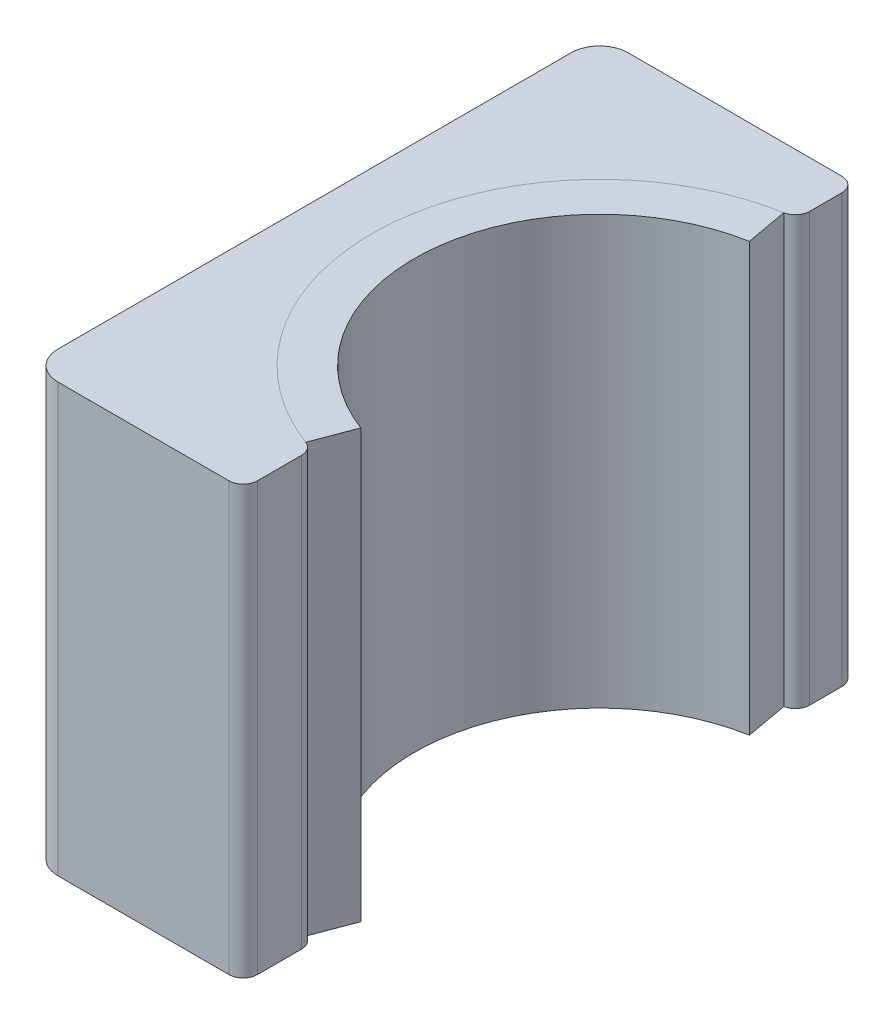
ISO-10303-21;
HEADER;
FILE_DESCRIPTION(('STEP AP214'),'2;1');
FILE_NAME('part.step','',(''),(''),'','','');
FILE_SCHEMA(('AUTOMOTIVE_DESIGN { 1 0 10303 214 1 1 1 1 }'));
ENDSEC;
DATA;
#1=APPLICATION_CONTEXT('core data for automotive mechanical design processes');
#2=APPLICATION_PROTOCOL_DEFINITION('international standard','automotive_design',2000,#1);
#3=PRODUCT_CONTEXT('',#1,'mechanical');
#4=PRODUCT('Part','Part','',(#3));
#5=PRODUCT_RELATED_PRODUCT_CATEGORY('part','',(#4));
#6=PRODUCT_DEFINITION_FORMATION('','',#4);
#7=PRODUCT_DEFINITION_CONTEXT('part definition',#1,'design');
#8=PRODUCT_DEFINITION('design','',#6,#7);
#9=PRODUCT_DEFINITION_SHAPE('','',#8);
#10=(LENGTH_UNIT() NAMED_UNIT(*) SI_UNIT(.MILLI.,.METRE.));
#11=(NAMED_UNIT(*) PLANE_ANGLE_UNIT() SI_UNIT($,.RADIAN.));
#12=(NAMED_UNIT(*) SI_UNIT($,.STERADIAN.) SOLID_ANGLE_UNIT());
#13=UNCERTAINTY_MEASURE_WITH_UNIT(LENGTH_MEASURE(1.E-05),#10,'distance_accuracy_value','');
#14=(GEOMETRIC_REPRESENTATION_CONTEXT(3) GLOBAL_UNCERTAINTY_ASSIGNED_CONTEXT((#13)) GLOBAL_UNIT_ASSIGNED_CONTEXT((#10,
#11,#12)) REPRESENTATION_CONTEXT('',''));
#15=CARTESIAN_POINT('',(0.,0.,0.));
#16=DIRECTION('',(0.,0.,1.));
#17=DIRECTION('',(1.,0.,0.));
#18=AXIS2_PLACEMENT_3D('',#15,#16,#17);
#19=CARTESIAN_POINT('',(17.,-15.,-19.));
#20=DIRECTION('',(0.,-1.,0.));
#21=DIRECTION('',(0.,0.,-1.));
#22=AXIS2_PLACEMENT_3D('',#19,#20,#21);
#23=PLANE('',#22);
#24=CARTESIAN_POINT('',(20.,-15.,0.));
#25=DIRECTION('',(0.,-1.,0.));
#26=DIRECTION('',(0.,0.,-1.));
#27=AXIS2_PLACEMENT_3D('',#24,#25,#26);
#28=CIRCLE('',#27,16.);
#29=CARTESIAN_POINT('',(17.1764705882353,-15.,-15.748894617112));
#30=VERTEX_POINT('',#29);
#31=CARTESIAN_POINT('',(14.3529411764706,-15.,14.9703282076112));
#32=VERTEX_POINT('',#31);
#33=EDGE_CURVE('E53',#30,#32,#28,.F.);
#34=ORIENTED_EDGE('',*,*,#33,.F.);
#35=DIRECTION('',(-0.176470588235294,0.,-0.984305913569501));
#36=VECTOR('',#35,1.);
#37=CARTESIAN_POINT('',(17.1764705882353,-15.,-15.748894617112));
#38=LINE('',#37,#36);
#39=CARTESIAN_POINT('',(17.7058823529412,-15.,-12.7959768764035));
#40=VERTEX_POINT('',#39);
#41=EDGE_CURVE('E76',#40,#30,#38,.T.);
#42=ORIENTED_EDGE('',*,*,#41,.F.);
#43=CARTESIAN_POINT('',(20.,-15.,0.));
#44=DIRECTION('',(0.,-1.,0.));
#45=DIRECTION('',(0.,0.,-1.));
#46=AXIS2_PLACEMENT_3D('',#43,#44,#45);
#47=CIRCLE('',#46,13.);
#48=CARTESIAN_POINT('',(15.4117647058824,-15.,12.1633916686841));
#49=VERTEX_POINT('',#48);
#50=EDGE_CURVE('E81',#49,#40,#47,.T.);
#51=ORIENTED_EDGE('',*,*,#50,.F.);
#52=DIRECTION('',(0.352941176470587,0.,-0.935645512975699));
#53=VECTOR('',#52,1.);
#54=CARTESIAN_POINT('',(15.4117647058824,-15.,12.1633916686841));
#55=LINE('',#54,#53);
#56=EDGE_CURVE('E96',#32,#49,#55,.T.);
#57=ORIENTED_EDGE('',*,*,#56,.F.);
#58=EDGE_LOOP('',(#34,#42,#51,#57));
#59=FACE_BOUND('',#58,.T.);
#60=ADVANCED_FACE('F45',(#59),#23,.T.);
#61=CARTESIAN_POINT('',(20.,15.,0.));
#62=DIRECTION('',(0.,1.,0.));
#63=DIRECTION('',(0.,0.,1.));
#64=AXIS2_PLACEMENT_3D('',#61,#62,#63);
#65=PLANE('',#64);
#66=CARTESIAN_POINT('',(20.,15.,0.));
#67=DIRECTION('',(0.,1.,0.));
#68=DIRECTION('',(0.,0.,1.));
#69=AXIS2_PLACEMENT_3D('',#66,#67,#68);
#70=CIRCLE('',#69,16.);
#71=CARTESIAN_POINT('',(17.1764705882353,15.,-15.748894617112));
#72=VERTEX_POINT('',#71);
#73=CARTESIAN_POINT('',(14.3529411764706,15.,14.9703282076112));
#74=VERTEX_POINT('',#73);
#75=EDGE_CURVE('E105',#72,#74,#70,.T.);
#76=ORIENTED_EDGE('',*,*,#75,.T.);
#77=DIRECTION('',(0.352941176470587,0.,-0.935645512975698));
#78=VECTOR('',#77,1.);
#79=CARTESIAN_POINT('',(15.4117647058824,15.,12.1633916686841));
#80=LINE('',#79,#78);
#81=CARTESIAN_POINT('',(15.4117647058824,15.,12.1633916686841));
#82=VERTEX_POINT('',#81);
#83=EDGE_CURVE('E94',#74,#82,#80,.T.);
#84=ORIENTED_EDGE('',*,*,#83,.T.);
#85=CARTESIAN_POINT('',(20.,15.,0.));
#86=DIRECTION('',(0.,-1.,0.));
#87=DIRECTION('',(0.,0.,1.));
#88=AXIS2_PLACEMENT_3D('',#85,#86,#87);
#89=CIRCLE('',#88,13.);
#90=CARTESIAN_POINT('',(17.7058823529412,15.,-12.7959768764035));
#91=VERTEX_POINT('',#90);
#92=EDGE_CURVE('E97',#82,#91,#89,.T.);
#93=ORIENTED_EDGE('',*,*,#92,.T.);
#94=DIRECTION('',(-0.176470588235294,0.,-0.984305913569501));
#95=VECTOR('',#94,1.);
#96=CARTESIAN_POINT('',(17.1764705882353,15.,-15.748894617112));
#97=LINE('',#96,#95);
#98=EDGE_CURVE('E102',#91,#72,#97,.T.);
#99=ORIENTED_EDGE('',*,*,#98,.T.);
#100=EDGE_LOOP('',(#76,#84,#93,#99));
#101=FACE_BOUND('',#100,.T.);
#102=ADVANCED_FACE('F104',(#101),#65,.T.);
#103=CARTESIAN_POINT('',(15.4117647058824,-48.6381013439769,12.1633916686841));
#104=DIRECTION('',(0.935645512975698,0.,0.352941176470587));
#105=DIRECTION('',(0.352941176470587,0.,-0.935645512975699));
#106=AXIS2_PLACEMENT_3D('',#103,#104,#105);
#107=PLANE('',#106);
#108=DIRECTION('',(0.,1.,0.));
#109=VECTOR('',#108,1.);
#110=CARTESIAN_POINT('',(14.3529411764706,-48.6381013439769,14.9703282076112));
#111=LINE('',#110,#109);
#112=EDGE_CURVE('E12',#32,#74,#111,.T.);
#113=ORIENTED_EDGE('',*,*,#112,.F.);
#114=ORIENTED_EDGE('',*,*,#56,.T.);
#115=DIRECTION('',(0.,1.,0.));
#116=VECTOR('',#115,1.);
#117=CARTESIAN_POINT('',(15.4117647058824,-48.6381013439769,12.1633916686841));
#118=LINE('',#117,#116);
#119=EDGE_CURVE('E91',#49,#82,#118,.T.);
#120=ORIENTED_EDGE('',*,*,#119,.T.);
#121=ORIENTED_EDGE('',*,*,#83,.F.);
#122=EDGE_LOOP('',(#113,#114,#120,#121));
#123=FACE_BOUND('',#122,.T.);
#124=ADVANCED_FACE('F92',(#123),#107,.T.);
#125=CARTESIAN_POINT('',(20.,-48.6381013439769,0.));
#126=DIRECTION('',(0.,1.,0.));
#127=DIRECTION('',(0.,0.,1.));
#128=AXIS2_PLACEMENT_3D('',#125,#126,#127);
#129=CYLINDRICAL_SURFACE('',#128,13.);
#130=ORIENTED_EDGE('',*,*,#119,.F.);
#131=ORIENTED_EDGE('',*,*,#50,.T.);
#132=DIRECTION('',(0.,1.,0.));
#133=VECTOR('',#132,1.);
#134=CARTESIAN_POINT('',(17.7058823529412,-48.6381013439769,-12.7959768764035));
#135=LINE('',#134,#133);
#136=EDGE_CURVE('E86',#40,#91,#135,.T.);
#137=ORIENTED_EDGE('',*,*,#136,.T.);
#138=ORIENTED_EDGE('',*,*,#92,.F.);
#139=EDGE_LOOP('',(#130,#131,#137,#138));
#140=FACE_BOUND('',#139,.T.);
#141=ADVANCED_FACE('F98',(#140),#129,.F.);
#142=CARTESIAN_POINT('',(17.1764705882353,-48.6381013439769,-15.748894617112));
#143=DIRECTION('',(0.984305913569501,0.,-0.176470588235294));
#144=DIRECTION('',(-0.176470588235294,0.,-0.984305913569501));
#145=AXIS2_PLACEMENT_3D('',#142,#143,#144);
#146=PLANE('',#145);
#147=ORIENTED_EDGE('',*,*,#136,.F.);
#148=ORIENTED_EDGE('',*,*,#41,.T.);
#149=DIRECTION('',(0.,1.,0.));
#150=VECTOR('',#149,1.);
#151=CARTESIAN_POINT('',(17.1764705882353,-48.6381013439769,-15.748894617112));
#152=LINE('',#151,#150);
#153=EDGE_CURVE('E112',#30,#72,#152,.T.);
#154=ORIENTED_EDGE('',*,*,#153,.T.);
#155=ORIENTED_EDGE('',*,*,#98,.F.);
#156=EDGE_LOOP('',(#147,#148,#154,#155));
#157=FACE_BOUND('',#156,.T.);
#158=ADVANCED_FACE('F118',(#157),#146,.T.);
#159=CARTESIAN_POINT('',(20.,-48.6381013439769,0.));
#160=DIRECTION('',(0.,1.,0.));
#161=DIRECTION('',(0.,0.,1.));
#162=AXIS2_PLACEMENT_3D('',#159,#160,#161);
#163=CYLINDRICAL_SURFACE('',#162,16.);
#164=ORIENTED_EDGE('',*,*,#153,.F.);
#165=ORIENTED_EDGE('',*,*,#33,.T.);
#166=ORIENTED_EDGE('',*,*,#112,.T.);
#167=ORIENTED_EDGE('',*,*,#75,.F.);
#168=EDGE_LOOP('',(#164,#165,#166,#167));
#169=FACE_BOUND('',#168,.T.);
#170=ADVANCED_FACE('F119',(#169),#163,.T.);
#171=CLOSED_SHELL('',(#60,#102,#124,#141,#158,#170));
#172=MANIFOLD_SOLID_BREP('B2_NOT_SHOWN',#171);
#173=CARTESIAN_POINT('',(20.,-15.,0.));
#174=DIRECTION('',(0.,1.,0.));
#175=DIRECTION('',(0.,0.,1.));
#176=AXIS2_PLACEMENT_3D('',#173,#174,#175);
#177=CYLINDRICAL_SURFACE('',#176,16.);
#178=CARTESIAN_POINT('',(8.38104996137778,-10.5,-11.));
#179=CARTESIAN_POINT('',(8.3810475620275,-10.6386845196879,-10.9999980279482));
#180=CARTESIAN_POINT('',(8.37185108734168,-10.7773815380396,-10.9903078456259));
#181=CARTESIAN_POINT('',(8.33612618465714,-11.0499193482511,-10.9523829005863));
#182=CARTESIAN_POINT('',(8.30958441363945,-11.1837563177435,-10.9241338612192));
#183=CARTESIAN_POINT('',(8.24209452212185,-11.4418457077826,-10.8514543052294));
#184=CARTESIAN_POINT('',(8.20125533540042,-11.5661621732974,-10.8071460580649));
#185=CARTESIAN_POINT('',(8.10824455663277,-11.8043605245881,-10.7047158943856));
#186=CARTESIAN_POINT('',(8.05606523434676,-11.9182352168475,-10.6465845525126));
#187=CARTESIAN_POINT('',(7.91954702173269,-12.1801691399977,-10.4917697319258));
#188=CARTESIAN_POINT('',(7.83090879926609,-12.3224812554831,-10.3891515910331));
#189=CARTESIAN_POINT('',(7.64325392445338,-12.5835976833256,-10.165247114262));
#190=CARTESIAN_POINT('',(7.54422155715111,-12.7023655926649,-10.0439323773569));
#191=CARTESIAN_POINT('',(7.33871414059765,-12.9181981505635,-9.78365169208199));
#192=CARTESIAN_POINT('',(7.23213385201703,-13.0148105504875,-9.64439565429435));
#193=CARTESIAN_POINT('',(7.01708096346853,-13.1829050178105,-9.35289526855976));
#194=CARTESIAN_POINT('',(6.90860848006324,-13.25438862749,-9.20065171843482));
#195=CARTESIAN_POINT('',(6.67369516689655,-13.3815497673433,-8.85776559140331));
#196=CARTESIAN_POINT('',(6.54746563965424,-13.432203477192,-8.66509100053056));
#197=CARTESIAN_POINT('',(6.30078957678406,-13.4945501123024,-8.26957035052267));
#198=CARTESIAN_POINT('',(6.18034531830766,-13.5062278180111,-8.06672034941593));
#199=CARTESIAN_POINT('',(6.00856540490153,-13.4922441104659,-7.76228526981618));
#200=CARTESIAN_POINT('',(5.95337821519235,-13.4826195415233,-7.66194663903574));
#201=CARTESIAN_POINT('',(5.845795347123,-13.452980672654,-7.4613264288262));
#202=CARTESIAN_POINT('',(5.79339821469234,-13.4329718442103,-7.36104484716721));
#203=CARTESIAN_POINT('',(5.69182890480617,-13.382307518014,-7.16161770352905));
#204=CARTESIAN_POINT('',(5.64265482355655,-13.351658373908,-7.06247149999667));
#205=CARTESIAN_POINT('',(5.54787158878631,-13.2795529773614,-6.86642765268352));
#206=CARTESIAN_POINT('',(5.50226179771551,-13.2380986634362,-6.76952960896113));
#207=CARTESIAN_POINT('',(5.42049753289846,-13.150356739905,-6.59139288493639));
#208=CARTESIAN_POINT('',(5.38387863710001,-13.1053570428793,-6.50973152939608));
#209=CARTESIAN_POINT('',(5.31378439874695,-13.0072548374729,-6.3500137418465));
#210=CARTESIAN_POINT('',(5.2803085427089,-12.9541536563784,-6.27195672205377));
#211=CARTESIAN_POINT('',(5.21665515001901,-12.8401147962579,-6.12041386042684));
#212=CARTESIAN_POINT('',(5.18647568088138,-12.7791817547183,-6.0469253513391));
#213=CARTESIAN_POINT('',(5.12950183594237,-12.6498786922659,-5.90543045066559));
#214=CARTESIAN_POINT('',(5.1027070845246,-12.5815094981442,-5.83742345107732));
#215=CARTESIAN_POINT('',(5.03345401111291,-12.3830492357788,-5.65839760871739));
#216=CARTESIAN_POINT('',(4.99457953296718,-12.2455589716542,-5.55399832430719));
#217=CARTESIAN_POINT('',(4.92759939640307,-11.9528776740198,-5.36958532117727));
#218=CARTESIAN_POINT('',(4.8994893180885,-11.7976939395442,-5.28956159654344));
#219=CARTESIAN_POINT('',(4.85526418073865,-11.4847641483737,-5.16151885950927));
#220=CARTESIAN_POINT('',(4.83849952885253,-11.3278098639282,-5.1117869675831));
#221=CARTESIAN_POINT('',(4.81402647049654,-11.0072167508132,-5.03862296637434));
#222=CARTESIAN_POINT('',(4.80631650161494,-10.8435790804253,-5.01518631980226));
#223=CARTESIAN_POINT('',(4.79991268554675,-10.5184173622382,-4.99574251139431));
#224=CARTESIAN_POINT('',(4.80100950615214,-10.3569351226618,-4.99909849350771));
#225=CARTESIAN_POINT('',(4.81173887596207,-10.0368837755444,-5.0316013404478));
#226=CARTESIAN_POINT('',(4.82137092259531,-9.87831449704335,-5.06074668674471));
#227=CARTESIAN_POINT('',(4.84924994831006,-9.56912535539221,-5.14360345462444));
#228=CARTESIAN_POINT('',(4.8674670954321,-9.41847995744886,-5.19722978833555));
#229=CARTESIAN_POINT('',(4.91267687978571,-9.12868428223856,-5.32704224792114));
#230=CARTESIAN_POINT('',(4.93966947934401,-8.98953395562618,-5.40322827694612));
#231=CARTESIAN_POINT('',(5.0029355317803,-8.72470533528119,-5.57643505669231));
#232=CARTESIAN_POINT('',(5.03931859465236,-8.59921289667592,-5.67369953432947));
#233=CARTESIAN_POINT('',(5.12114749911893,-8.36663991918536,-5.88494295925601));
#234=CARTESIAN_POINT('',(5.16659424971289,-8.25956122902689,-5.99892358270806));
#235=CARTESIAN_POINT('',(5.26807411172599,-8.06229547189356,-6.24408197662044));
#236=CARTESIAN_POINT('',(5.32443416692612,-7.97287130916769,-6.37573691966289));
#237=CARTESIAN_POINT('',(5.44589250774826,-7.81715801113458,-6.64832532336101));
#238=CARTESIAN_POINT('',(5.51099319094543,-7.75087524159141,-6.78926132440927));
#239=CARTESIAN_POINT('',(5.65410696550318,-7.63756818500975,-7.08693000675256));
#240=CARTESIAN_POINT('',(5.73272066364865,-7.5923461550138,-7.24405737956683));
#241=CARTESIAN_POINT('',(5.89742194745821,-7.52811301848813,-7.5596986228227));
#242=CARTESIAN_POINT('',(5.9835124683085,-7.50911225556616,-7.71821301560877));
#243=CARTESIAN_POINT('',(6.17162892881427,-7.49530585894294,-8.05087896900503));
#244=CARTESIAN_POINT('',(6.27435357960196,-7.50349836798677,-8.22475816196607));
#245=CARTESIAN_POINT('',(6.48454198768442,-7.54880907444915,-8.56578171646486));
#246=CARTESIAN_POINT('',(6.59200898801574,-7.58594736482288,-8.73292131486089));
#247=CARTESIAN_POINT('',(6.82233969086164,-7.69360111577277,-9.07729222895156));
#248=CARTESIAN_POINT('',(6.945473287282,-7.76765577367554,-9.25324170497194));
#249=CARTESIAN_POINT('',(7.19009089108069,-7.94826168749561,-9.58902354164263));
#250=CARTESIAN_POINT('',(7.31157445049567,-8.05482159097734,-9.74885159834096));
#251=CARTESIAN_POINT('',(7.53136945832989,-8.28296792760897,-10.0279828171026));
#252=CARTESIAN_POINT('',(7.63058810738281,-8.40055213085571,-10.1498419978061));
#253=CARTESIAN_POINT('',(7.81888553259108,-8.65923844733104,-10.3750613075972));
#254=CARTESIAN_POINT('',(7.90797961818671,-8.80030423566979,-10.4784495060113));
#255=CARTESIAN_POINT('',(8.04994223768419,-9.06829620577229,-10.6397728234362));
#256=CARTESIAN_POINT('',(8.10635632163245,-9.1903568022142,-10.7026505378468));
#257=CARTESIAN_POINT('',(8.20602449888157,-9.44651017774951,-10.8123836844924));
#258=CARTESIAN_POINT('',(8.24929442378798,-9.58058822807855,-10.8592584001905));
#259=CARTESIAN_POINT('',(8.31535120025386,-9.84416415123072,-10.9302846179059));
#260=CARTESIAN_POINT('',(8.33976688291688,-9.9727541342672,-10.9562546178131));
#261=CARTESIAN_POINT('',(8.37261246848133,-10.234227391227,-10.9911079686025));
#262=CARTESIAN_POINT('',(8.38105226051369,-10.3671079574149,-11.0000018896846));
#263=CARTESIAN_POINT('',(8.38104996137778,-10.5,-11.));
#264=B_SPLINE_CURVE_WITH_KNOTS('',3,(#178,#179,#180,#181,#182,#183,#184,#185,#186,#187,#188,
#189,#190,#191,#192,#193,#194,#195,#196,#197,#198,#199,#200,#201,#202,#203,#204,#205,#206,#207,
#208,#209,#210,#211,#212,#213,#214,#215,#216,#217,#218,#219,#220,#221,#222,#223,#224,#225,#226,
#227,#228,#229,#230,#231,#232,#233,#234,#235,#236,#237,#238,#239,#240,#241,#242,#243,#244,#245,
#246,#247,#248,#249,#250,#251,#252,#253,#254,#255,#256,#257,#258,#259,#260,#261,#262,#263),
.UNSPECIFIED.,.T.,.F.,(4,2,2,2,2,2,2,2,2,2,2,2,2,2,2,2,2,2,2,2,2,2,2,2,2,2,2,2,2,2,2,2,2,2,2,2,
2,2,2,2,2,2,4),(0.,0.415470707433495,0.8312613961061,1.24395069861444,1.65692220673055,
2.24345674492876,2.83089120262561,3.42941991599914,4.02791188823337,4.73214225272623,
5.43664757660654,5.78098846913266,6.12514811181006,6.46910259907719,6.81299542116966,
7.11309158478706,7.41313863559321,7.71300883078604,8.01284571883038,8.54069625304213,
9.06832981718426,9.56237995216554,10.0563448248355,10.5386038300059,11.0208344406825,
11.5014015892144,11.9819666746859,12.4684170164543,12.9549161690015,13.4592454319845,
13.9637133174017,14.5057573791358,15.0480152020899,15.6519566538021,16.2563177102871,
16.9349072687561,17.6136775141321,18.2003249912317,18.7860732458368,19.2297895292747,
19.6729692358381,20.0713335256957,20.4694511459561),.UNSPECIFIED.);
#265=CARTESIAN_POINT('',(8.38104996137778,-10.5,-11.));
#266=VERTEX_POINT('',#265);
#267=EDGE_CURVE('E348',#266,#266,#264,.T.);
#268=ORIENTED_EDGE('',*,*,#267,.T.);
#269=EDGE_LOOP('',(#268));
#270=FACE_BOUND('',#269,.T.);
#271=DIRECTION('',(0.,1.,0.));
#272=VECTOR('',#271,1.);
#273=CARTESIAN_POINT('',(17.1764705882353,-15.,-15.748894617112));
#274=LINE('',#273,#272);
#275=CARTESIAN_POINT('',(17.1764705882353,-15.,-15.748894617112));
#276=VERTEX_POINT('',#275);
#277=CARTESIAN_POINT('',(17.1764705882353,15.,-15.748894617112));
#278=VERTEX_POINT('',#277);
#279=EDGE_CURVE('E334',#276,#278,#274,.T.);
#280=ORIENTED_EDGE('',*,*,#279,.T.);
#281=CARTESIAN_POINT('',(20.,15.,0.));
#282=DIRECTION('',(0.,-1.,0.));
#283=DIRECTION('',(0.,0.,1.));
#284=AXIS2_PLACEMENT_3D('',#281,#282,#283);
#285=CIRCLE('',#284,16.);
#286=CARTESIAN_POINT('',(14.3529411764706,15.,14.9703282076112));
#287=VERTEX_POINT('',#286);
#288=EDGE_CURVE('E290',#287,#278,#285,.T.);
#289=ORIENTED_EDGE('',*,*,#288,.F.);
#290=DIRECTION('',(0.,1.,0.));
#291=VECTOR('',#290,1.);
#292=CARTESIAN_POINT('',(14.3529411764706,-15.,14.9703282076112));
#293=LINE('',#292,#291);
#294=CARTESIAN_POINT('',(14.3529411764706,-15.,14.9703282076112));
#295=VERTEX_POINT('',#294);
#296=EDGE_CURVE('E336',#295,#287,#293,.T.);
#297=ORIENTED_EDGE('',*,*,#296,.F.);
#298=CARTESIAN_POINT('',(20.,-15.,0.));
#299=DIRECTION('',(0.,-1.,0.));
#300=DIRECTION('',(0.,0.,1.));
#301=AXIS2_PLACEMENT_3D('',#298,#299,#300);
#302=CIRCLE('',#301,16.);
#303=EDGE_CURVE('E316',#295,#276,#302,.T.);
#304=ORIENTED_EDGE('',*,*,#303,.T.);
#305=EDGE_LOOP('',(#280,#289,#297,#304));
#306=FACE_BOUND('',#305,.T.);
#307=CARTESIAN_POINT('',(8.38104996137779,10.5,-11.));
#308=CARTESIAN_POINT('',(8.38104756202751,10.3613154803121,-10.9999980279482));
#309=CARTESIAN_POINT('',(8.37185108734168,10.2226184619604,-10.9903078456259));
#310=CARTESIAN_POINT('',(8.33612618465715,9.95008065174892,-10.9523829005863));
#311=CARTESIAN_POINT('',(8.30958441363946,9.81624368225646,-10.9241338612192));
#312=CARTESIAN_POINT('',(8.24209452212185,9.55815429221737,-10.8514543052294));
#313=CARTESIAN_POINT('',(8.20125533540042,9.43383782670256,-10.807146058065));
#314=CARTESIAN_POINT('',(8.10824455663277,9.19563947541191,-10.7047158943856));
#315=CARTESIAN_POINT('',(8.05606523434676,9.0817647831525,-10.6465845525126));
#316=CARTESIAN_POINT('',(7.91954702173269,8.81983086000231,-10.4917697319258));
#317=CARTESIAN_POINT('',(7.83090879926609,8.6775187445169,-10.3891515910331));
#318=CARTESIAN_POINT('',(7.64325392445338,8.41640231667437,-10.165247114262));
#319=CARTESIAN_POINT('',(7.54422155715112,8.2976344073351,-10.0439323773569));
#320=CARTESIAN_POINT('',(7.33871414059765,8.08180184943648,-9.78365169208199));
#321=CARTESIAN_POINT('',(7.23213385201703,7.98518944951246,-9.64439565429435));
#322=CARTESIAN_POINT('',(7.01708096346854,7.81709498218948,-9.35289526855976));
#323=CARTESIAN_POINT('',(6.90860848006324,7.74561137251004,-9.20065171843483));
#324=CARTESIAN_POINT('',(6.67369516689656,7.6184502326567,-8.85776559140331));
#325=CARTESIAN_POINT('',(6.54746563965424,7.56779652280801,-8.66509100053057));
#326=CARTESIAN_POINT('',(6.30078957678406,7.50544988769759,-8.26957035052268));
#327=CARTESIAN_POINT('',(6.18034531830766,7.49377218198891,-8.06672034941593));
#328=CARTESIAN_POINT('',(6.00856540490153,7.50775588953414,-7.76228526981618));
#329=CARTESIAN_POINT('',(5.95337821519235,7.51738045847669,-7.66194663903575));
#330=CARTESIAN_POINT('',(5.845795347123,7.54701932734603,-7.4613264288262));
#331=CARTESIAN_POINT('',(5.79339821469235,7.56702815578966,-7.36104484716721));
#332=CARTESIAN_POINT('',(5.69182890480617,7.61769248198598,-7.16161770352905));
#333=CARTESIAN_POINT('',(5.64265482355655,7.64834162609198,-7.06247149999667));
#334=CARTESIAN_POINT('',(5.54787158878631,7.72044702263857,-6.86642765268353));
#335=CARTESIAN_POINT('',(5.50226179771551,7.76190133656378,-6.76952960896113));
#336=CARTESIAN_POINT('',(5.42049753289846,7.849643260095,-6.59139288493639));
#337=CARTESIAN_POINT('',(5.38387863710002,7.89464295712066,-6.50973152939608));
#338=CARTESIAN_POINT('',(5.31378439874695,7.99274516252714,-6.35001374184651));
#339=CARTESIAN_POINT('',(5.2803085427089,8.04584634362164,-6.27195672205378));
#340=CARTESIAN_POINT('',(5.21665515001901,8.15988520374208,-6.12041386042684));
#341=CARTESIAN_POINT('',(5.18647568088138,8.22081824528172,-6.0469253513391));
#342=CARTESIAN_POINT('',(5.12950183594237,8.35012130773412,-5.9054304506656));
#343=CARTESIAN_POINT('',(5.10270708452461,8.41849050185583,-5.83742345107732));
#344=CARTESIAN_POINT('',(5.03345401111292,8.61695076422121,-5.65839760871739));
#345=CARTESIAN_POINT('',(4.99457953296718,8.75444102834575,-5.55399832430719));
#346=CARTESIAN_POINT('',(4.92759939640307,9.04712232598017,-5.36958532117727));
#347=CARTESIAN_POINT('',(4.8994893180885,9.20230606045576,-5.28956159654344));
#348=CARTESIAN_POINT('',(4.85526418073866,9.51523585162634,-5.16151885950927));
#349=CARTESIAN_POINT('',(4.83849952885253,9.67219013607182,-5.1117869675831));
#350=CARTESIAN_POINT('',(4.81402647049655,9.99278324918681,-5.03862296637434));
#351=CARTESIAN_POINT('',(4.80631650161494,10.1564209195747,-5.01518631980227));
#352=CARTESIAN_POINT('',(4.79991268554675,10.4815826377618,-4.99574251139432));
#353=CARTESIAN_POINT('',(4.80100950615215,10.6430648773382,-4.99909849350771));
#354=CARTESIAN_POINT('',(4.81173887596207,10.9631162244556,-5.03160134044781));
#355=CARTESIAN_POINT('',(4.82137092259531,11.1216855029567,-5.06074668674471));
#356=CARTESIAN_POINT('',(4.84924994831006,11.4308746446078,-5.14360345462444));
#357=CARTESIAN_POINT('',(4.86746709543211,11.5815200425511,-5.19722978833556));
#358=CARTESIAN_POINT('',(4.91267687978571,11.8713157177614,-5.32704224792115));
#359=CARTESIAN_POINT('',(4.93966947934401,12.0104660443738,-5.40322827694612));
#360=CARTESIAN_POINT('',(5.0029355317803,12.2752946647188,-5.57643505669231));
#361=CARTESIAN_POINT('',(5.03931859465236,12.4007871033241,-5.67369953432947));
#362=CARTESIAN_POINT('',(5.12114749911894,12.6333600808146,-5.88494295925601));
#363=CARTESIAN_POINT('',(5.1665942497129,12.7404387709731,-5.99892358270806));
#364=CARTESIAN_POINT('',(5.26807411172599,12.9377045281064,-6.24408197662044));
#365=CARTESIAN_POINT('',(5.32443416692612,13.0271286908323,-6.3757369196629));
#366=CARTESIAN_POINT('',(5.44589250774826,13.1828419888654,-6.64832532336102));
#367=CARTESIAN_POINT('',(5.51099319094544,13.2491247584086,-6.78926132440928));
#368=CARTESIAN_POINT('',(5.65410696550319,13.3624318149902,-7.08693000675256));
#369=CARTESIAN_POINT('',(5.73272066364865,13.4076538449862,-7.24405737956684));
#370=CARTESIAN_POINT('',(5.89742194745821,13.4718869815119,-7.55969862282271));
#371=CARTESIAN_POINT('',(5.9835124683085,13.4908877444338,-7.71821301560877));
#372=CARTESIAN_POINT('',(6.17162892881427,13.5046941410571,-8.05087896900503));
#373=CARTESIAN_POINT('',(6.27435357960196,13.4965016320132,-8.22475816196607));
#374=CARTESIAN_POINT('',(6.48454198768442,13.4511909255509,-8.56578171646486));
#375=CARTESIAN_POINT('',(6.59200898801574,13.4140526351771,-8.73292131486089));
#376=CARTESIAN_POINT('',(6.82233969086164,13.3063988842272,-9.07729222895156));
#377=CARTESIAN_POINT('',(6.945473287282,13.2323442263245,-9.25324170497194));
#378=CARTESIAN_POINT('',(7.19009089108069,13.0517383125044,-9.58902354164263));
#379=CARTESIAN_POINT('',(7.31157445049567,12.9451784090227,-9.74885159834097));
#380=CARTESIAN_POINT('',(7.53136945832989,12.717032072391,-10.0279828171026));
#381=CARTESIAN_POINT('',(7.63058810738282,12.5994478691443,-10.1498419978061));
#382=CARTESIAN_POINT('',(7.81888553259108,12.340761552669,-10.3750613075972));
#383=CARTESIAN_POINT('',(7.90797961818672,12.1996957643302,-10.4784495060113));
#384=CARTESIAN_POINT('',(8.04994223768419,11.9317037942277,-10.6397728234362));
#385=CARTESIAN_POINT('',(8.10635632163245,11.8096431977858,-10.7026505378468));
#386=CARTESIAN_POINT('',(8.20602449888157,11.5534898222505,-10.8123836844924));
#387=CARTESIAN_POINT('',(8.24929442378798,11.4194117719214,-10.8592584001905));
#388=CARTESIAN_POINT('',(8.31535120025386,11.1558358487693,-10.9302846179059));
#389=CARTESIAN_POINT('',(8.33976688291688,11.0272458657328,-10.9562546178131));
#390=CARTESIAN_POINT('',(8.37261246848133,10.765772608773,-10.9911079686025));
#391=CARTESIAN_POINT('',(8.3810522605137,10.6328920425851,-11.0000018896846));
#392=CARTESIAN_POINT('',(8.38104996137779,10.5,-11.));
#393=B_SPLINE_CURVE_WITH_KNOTS('',3,(#307,#308,#309,#310,#311,#312,#313,#314,#315,#316,#317,
#318,#319,#320,#321,#322,#323,#324,#325,#326,#327,#328,#329,#330,#331,#332,#333,#334,#335,#336,
#337,#338,#339,#340,#341,#342,#343,#344,#345,#346,#347,#348,#349,#350,#351,#352,#353,#354,#355,
#356,#357,#358,#359,#360,#361,#362,#363,#364,#365,#366,#367,#368,#369,#370,#371,#372,#373,#374,
#375,#376,#377,#378,#379,#380,#381,#382,#383,#384,#385,#386,#387,#388,#389,#390,#391,#392),
.UNSPECIFIED.,.T.,.F.,(4,2,2,2,2,2,2,2,2,2,2,2,2,2,2,2,2,2,2,2,2,2,2,2,2,2,2,2,2,2,2,2,2,2,2,2,
2,2,2,2,2,2,4),(0.,0.415470707433495,0.8312613961061,1.24395069861444,1.65692220673055,
2.24345674492876,2.83089120262561,3.42941991599914,4.02791188823336,4.73214225272623,
5.43664757660653,5.78098846913266,6.12514811181006,6.46910259907719,6.81299542116966,
7.11309158478706,7.41313863559321,7.71300883078604,8.01284571883038,8.54069625304213,
9.06832981718426,9.56237995216554,10.0563448248355,10.5386038300059,11.0208344406825,
11.5014015892144,11.9819666746859,12.4684170164543,12.9549161690015,13.4592454319845,
13.9637133174017,14.5057573791358,15.0480152020899,15.6519566538021,16.2563177102871,
16.9349072687561,17.6136775141321,18.2003249912317,18.7860732458368,19.2297895292747,
19.6729692358381,20.0713335256957,20.4694511459561),.UNSPECIFIED.);
#394=CARTESIAN_POINT('',(8.38104996137779,10.5,-11.));
#395=VERTEX_POINT('',#394);
#396=EDGE_CURVE('E356',#395,#395,#393,.T.);
#397=ORIENTED_EDGE('',*,*,#396,.T.);
#398=EDGE_LOOP('',(#397));
#399=FACE_BOUND('',#398,.T.);
#400=ADVANCED_FACE('F169',(#270,#306,#399),#177,.F.);
#401=CARTESIAN_POINT('',(0.,-15.,-20.));
#402=DIRECTION('',(0.,0.,-1.));
#403=DIRECTION('',(-1.,0.,0.));
#404=AXIS2_PLACEMENT_3D('',#401,#402,#403);
#405=PLANE('',#404);
#406=DIRECTION('',(-1.,0.,0.));
#407=VECTOR('',#406,1.);
#408=CARTESIAN_POINT('',(0.,-15.,-20.));
#409=LINE('',#408,#407);
#410=CARTESIAN_POINT('',(17.,-15.,-20.));
#411=VERTEX_POINT('',#410);
#412=CARTESIAN_POINT('',(2.,-15.,-20.));
#413=VERTEX_POINT('',#412);
#414=EDGE_CURVE('E302',#411,#413,#409,.T.);
#415=ORIENTED_EDGE('',*,*,#414,.T.);
#416=DIRECTION('',(0.,1.,0.));
#417=VECTOR('',#416,1.);
#418=CARTESIAN_POINT('',(2.,-15.,-20.));
#419=LINE('',#418,#417);
#420=CARTESIAN_POINT('',(2.,15.,-20.));
#421=VERTEX_POINT('',#420);
#422=EDGE_CURVE('E43',#413,#421,#419,.T.);
#423=ORIENTED_EDGE('',*,*,#422,.T.);
#424=DIRECTION('',(-1.,0.,0.));
#425=VECTOR('',#424,1.);
#426=CARTESIAN_POINT('',(0.,15.,-20.));
#427=LINE('',#426,#425);
#428=CARTESIAN_POINT('',(17.,15.,-20.));
#429=VERTEX_POINT('',#428);
#430=EDGE_CURVE('E426',#429,#421,#427,.T.);
#431=ORIENTED_EDGE('',*,*,#430,.F.);
#432=DIRECTION('',(0.,1.,0.));
#433=VECTOR('',#432,1.);
#434=CARTESIAN_POINT('',(17.,-15.,-20.));
#435=LINE('',#434,#433);
#436=EDGE_CURVE('E327',#411,#429,#435,.T.);
#437=ORIENTED_EDGE('',*,*,#436,.F.);
#438=EDGE_LOOP('',(#415,#423,#431,#437));
#439=FACE_BOUND('',#438,.T.);
#440=ADVANCED_FACE('F392',(#439),#405,.T.);
#441=CARTESIAN_POINT('',(17.,-15.,-19.));
#442=DIRECTION('',(0.,1.,0.));
#443=DIRECTION('',(0.,0.,1.));
#444=AXIS2_PLACEMENT_3D('',#441,#442,#443);
#445=CYLINDRICAL_SURFACE('',#444,1.);
#446=ORIENTED_EDGE('',*,*,#436,.T.);
#447=CARTESIAN_POINT('',(17.,15.,-19.));
#448=DIRECTION('',(0.,1.,0.));
#449=DIRECTION('',(0.,0.,-1.));
#450=AXIS2_PLACEMENT_3D('',#447,#448,#449);
#451=CIRCLE('',#450,1.);
#452=CARTESIAN_POINT('',(18.,15.,-19.));
#453=VERTEX_POINT('',#452);
#454=EDGE_CURVE('E299',#453,#429,#451,.T.);
#455=ORIENTED_EDGE('',*,*,#454,.F.);
#456=DIRECTION('',(0.,1.,0.));
#457=VECTOR('',#456,1.);
#458=CARTESIAN_POINT('',(18.,-15.,-19.));
#459=LINE('',#458,#457);
#460=CARTESIAN_POINT('',(18.,-15.,-19.));
#461=VERTEX_POINT('',#460);
#462=EDGE_CURVE('E330',#461,#453,#459,.T.);
#463=ORIENTED_EDGE('',*,*,#462,.F.);
#464=CARTESIAN_POINT('',(17.,-15.,-19.));
#465=DIRECTION('',(0.,1.,0.));
#466=DIRECTION('',(0.,0.,-1.));
#467=AXIS2_PLACEMENT_3D('',#464,#465,#466);
#468=CIRCLE('',#467,1.);
#469=EDGE_CURVE('E279',#461,#411,#468,.T.);
#470=ORIENTED_EDGE('',*,*,#469,.T.);
#471=EDGE_LOOP('',(#446,#455,#463,#470));
#472=FACE_BOUND('',#471,.T.);
#473=ADVANCED_FACE('F388',(#472),#445,.T.);
#474=CARTESIAN_POINT('',(18.,-15.,-19.));
#475=DIRECTION('',(1.,0.,0.));
#476=DIRECTION('',(0.,0.,-1.));
#477=AXIS2_PLACEMENT_3D('',#474,#475,#476);
#478=PLANE('',#477);
#479=ORIENTED_EDGE('',*,*,#462,.T.);
#480=DIRECTION('',(0.,0.,-1.));
#481=VECTOR('',#480,1.);
#482=CARTESIAN_POINT('',(18.,15.,-19.));
#483=LINE('',#482,#481);
#484=CARTESIAN_POINT('',(18.,15.,-16.7332005306815));
#485=VERTEX_POINT('',#484);
#486=EDGE_CURVE('E296',#485,#453,#483,.T.);
#487=ORIENTED_EDGE('',*,*,#486,.F.);
#488=DIRECTION('',(0.,1.,0.));
#489=VECTOR('',#488,1.);
#490=CARTESIAN_POINT('',(18.,-15.,-16.7332005306815));
#491=LINE('',#490,#489);
#492=CARTESIAN_POINT('',(18.,-15.,-16.7332005306815));
#493=VERTEX_POINT('',#492);
#494=EDGE_CURVE('E332',#493,#485,#491,.T.);
#495=ORIENTED_EDGE('',*,*,#494,.F.);
#496=DIRECTION('',(0.,0.,-1.));
#497=VECTOR('',#496,1.);
#498=CARTESIAN_POINT('',(18.,-15.,-19.));
#499=LINE('',#498,#497);
#500=EDGE_CURVE('E322',#493,#461,#499,.T.);
#501=ORIENTED_EDGE('',*,*,#500,.T.);
#502=EDGE_LOOP('',(#479,#487,#495,#501));
#503=FACE_BOUND('',#502,.T.);
#504=ADVANCED_FACE('F391',(#503),#478,.T.);
#505=CARTESIAN_POINT('',(17.,-15.,-16.7332005306815));
#506=DIRECTION('',(0.,1.,0.));
#507=DIRECTION('',(0.,0.,1.));
#508=AXIS2_PLACEMENT_3D('',#505,#506,#507);
#509=CYLINDRICAL_SURFACE('',#508,1.);
#510=ORIENTED_EDGE('',*,*,#494,.T.);
#511=CARTESIAN_POINT('',(17.,15.,-16.7332005306815));
#512=DIRECTION('',(0.,1.,0.));
#513=DIRECTION('',(0.,0.,-1.));
#514=AXIS2_PLACEMENT_3D('',#511,#512,#513);
#515=CIRCLE('',#514,1.);
#516=EDGE_CURVE('E293',#278,#485,#515,.T.);
#517=ORIENTED_EDGE('',*,*,#516,.F.);
#518=ORIENTED_EDGE('',*,*,#279,.F.);
#519=CARTESIAN_POINT('',(17.,-15.,-16.7332005306815));
#520=DIRECTION('',(0.,1.,0.));
#521=DIRECTION('',(0.,0.,-1.));
#522=AXIS2_PLACEMENT_3D('',#519,#520,#521);
#523=CIRCLE('',#522,1.);
#524=EDGE_CURVE('E319',#276,#493,#523,.T.);
#525=ORIENTED_EDGE('',*,*,#524,.T.);
#526=EDGE_LOOP('',(#510,#517,#518,#525));
#527=FACE_BOUND('',#526,.T.);
#528=ADVANCED_FACE('F395',(#527),#509,.T.);
#529=CARTESIAN_POINT('',(14.,-15.,15.9059737205869));
#530=DIRECTION('',(0.,1.,0.));
#531=DIRECTION('',(0.,0.,1.));
#532=AXIS2_PLACEMENT_3D('',#529,#530,#531);
#533=CYLINDRICAL_SURFACE('',#532,1.);
#534=ORIENTED_EDGE('',*,*,#296,.T.);
#535=CARTESIAN_POINT('',(14.,15.,15.9059737205869));
#536=DIRECTION('',(0.,1.,0.));
#537=DIRECTION('',(0.,0.,1.));
#538=AXIS2_PLACEMENT_3D('',#535,#536,#537);
#539=CIRCLE('',#538,1.);
#540=CARTESIAN_POINT('',(15.,15.,15.9059737205869));
#541=VERTEX_POINT('',#540);
#542=EDGE_CURVE('E284',#541,#287,#539,.T.);
#543=ORIENTED_EDGE('',*,*,#542,.F.);
#544=DIRECTION('',(0.,1.,0.));
#545=VECTOR('',#544,1.);
#546=CARTESIAN_POINT('',(15.,-15.,15.9059737205869));
#547=LINE('',#546,#545);
#548=CARTESIAN_POINT('',(15.,-15.,15.9059737205869));
#549=VERTEX_POINT('',#548);
#550=EDGE_CURVE('E338',#549,#541,#547,.T.);
#551=ORIENTED_EDGE('',*,*,#550,.F.);
#552=CARTESIAN_POINT('',(14.,-15.,15.9059737205869));
#553=DIRECTION('',(0.,1.,0.));
#554=DIRECTION('',(0.,0.,1.));
#555=AXIS2_PLACEMENT_3D('',#552,#553,#554);
#556=CIRCLE('',#555,1.);
#557=EDGE_CURVE('E313',#549,#295,#556,.T.);
#558=ORIENTED_EDGE('',*,*,#557,.T.);
#559=EDGE_LOOP('',(#534,#543,#551,#558));
#560=FACE_BOUND('',#559,.T.);
#561=ADVANCED_FACE('F398',(#560),#533,.T.);
#562=CARTESIAN_POINT('',(15.,-15.,15.9059737205869));
#563=DIRECTION('',(1.,0.,0.));
#564=DIRECTION('',(0.,0.,-1.));
#565=AXIS2_PLACEMENT_3D('',#562,#563,#564);
#566=PLANE('',#565);
#567=ORIENTED_EDGE('',*,*,#550,.T.);
#568=DIRECTION('',(0.,0.,-1.));
#569=VECTOR('',#568,1.);
#570=CARTESIAN_POINT('',(15.,15.,15.9059737205869));
#571=LINE('',#570,#569);
#572=CARTESIAN_POINT('',(15.,15.,19.));
#573=VERTEX_POINT('',#572);
#574=EDGE_CURVE('E282',#573,#541,#571,.T.);
#575=ORIENTED_EDGE('',*,*,#574,.F.);
#576=DIRECTION('',(0.,1.,0.));
#577=VECTOR('',#576,1.);
#578=CARTESIAN_POINT('',(15.,-15.,19.));
#579=LINE('',#578,#577);
#580=CARTESIAN_POINT('',(15.,-15.,19.));
#581=VERTEX_POINT('',#580);
#582=EDGE_CURVE('E278',#581,#573,#579,.T.);
#583=ORIENTED_EDGE('',*,*,#582,.F.);
#584=DIRECTION('',(0.,0.,-1.));
#585=VECTOR('',#584,1.);
#586=CARTESIAN_POINT('',(15.,-15.,15.9059737205869));
#587=LINE('',#586,#585);
#588=EDGE_CURVE('E310',#581,#549,#587,.T.);
#589=ORIENTED_EDGE('',*,*,#588,.T.);
#590=EDGE_LOOP('',(#567,#575,#583,#589));
#591=FACE_BOUND('',#590,.T.);
#592=ADVANCED_FACE('F403',(#591),#566,.T.);
#593=CARTESIAN_POINT('',(14.,-15.,19.));
#594=DIRECTION('',(0.,1.,0.));
#595=DIRECTION('',(0.,0.,1.));
#596=AXIS2_PLACEMENT_3D('',#593,#594,#595);
#597=CYLINDRICAL_SURFACE('',#596,1.);
#598=ORIENTED_EDGE('',*,*,#582,.T.);
#599=CARTESIAN_POINT('',(14.,15.,19.));
#600=DIRECTION('',(0.,1.,0.));
#601=DIRECTION('',(0.,0.,-1.));
#602=AXIS2_PLACEMENT_3D('',#599,#600,#601);
#603=CIRCLE('',#602,1.);
#604=CARTESIAN_POINT('',(14.,15.,20.));
#605=VERTEX_POINT('',#604);
#606=EDGE_CURVE('E266',#605,#573,#603,.T.);
#607=ORIENTED_EDGE('',*,*,#606,.F.);
#608=DIRECTION('',(0.,1.,0.));
#609=VECTOR('',#608,1.);
#610=CARTESIAN_POINT('',(14.,-15.,20.));
#611=LINE('',#610,#609);
#612=CARTESIAN_POINT('',(14.,-15.,20.));
#613=VERTEX_POINT('',#612);
#614=EDGE_CURVE('E272',#613,#605,#611,.T.);
#615=ORIENTED_EDGE('',*,*,#614,.F.);
#616=CARTESIAN_POINT('',(14.,-15.,19.));
#617=DIRECTION('',(0.,1.,0.));
#618=DIRECTION('',(0.,0.,-1.));
#619=AXIS2_PLACEMENT_3D('',#616,#617,#618);
#620=CIRCLE('',#619,1.);
#621=EDGE_CURVE('E308',#613,#581,#620,.T.);
#622=ORIENTED_EDGE('',*,*,#621,.T.);
#623=EDGE_LOOP('',(#598,#607,#615,#622));
#624=FACE_BOUND('',#623,.T.);
#625=ADVANCED_FACE('F281',(#624),#597,.T.);
#626=CARTESIAN_POINT('',(14.,-15.,20.));
#627=DIRECTION('',(0.,0.,1.));
#628=DIRECTION('',(1.,0.,0.));
#629=AXIS2_PLACEMENT_3D('',#626,#627,#628);
#630=PLANE('',#629);
#631=DIRECTION('',(1.,0.,0.));
#632=VECTOR('',#631,1.);
#633=CARTESIAN_POINT('',(14.,15.,20.));
#634=LINE('',#633,#632);
#635=CARTESIAN_POINT('',(2.00000000000001,15.,20.));
#636=VERTEX_POINT('',#635);
#637=EDGE_CURVE('E260',#636,#605,#634,.T.);
#638=ORIENTED_EDGE('',*,*,#637,.F.);
#639=DIRECTION('',(0.,1.,0.));
#640=VECTOR('',#639,1.);
#641=CARTESIAN_POINT('',(2.00000000000001,-15.,20.));
#642=LINE('',#641,#640);
#643=CARTESIAN_POINT('',(2.00000000000001,-15.,20.));
#644=VERTEX_POINT('',#643);
#645=EDGE_CURVE('E192',#636,#644,#642,.F.);
#646=ORIENTED_EDGE('',*,*,#645,.T.);
#647=DIRECTION('',(1.,0.,0.));
#648=VECTOR('',#647,1.);
#649=CARTESIAN_POINT('',(14.,-15.,20.));
#650=LINE('',#649,#648);
#651=EDGE_CURVE('E274',#644,#613,#650,.T.);
#652=ORIENTED_EDGE('',*,*,#651,.T.);
#653=ORIENTED_EDGE('',*,*,#614,.T.);
#654=EDGE_LOOP('',(#638,#646,#652,#653));
#655=FACE_BOUND('',#654,.T.);
#656=ADVANCED_FACE('F273',(#655),#630,.T.);
#657=CARTESIAN_POINT('',(0.,-15.,-20.));
#658=DIRECTION('',(-1.,0.,0.));
#659=DIRECTION('',(0.,0.,1.));
#660=AXIS2_PLACEMENT_3D('',#657,#658,#659);
#661=PLANE('',#660);
#662=CARTESIAN_POINT('',(0.,10.5,-8.00000000000003));
#663=DIRECTION('',(1.,0.,0.));
#664=DIRECTION('',(0.,0.,-1.));
#665=AXIS2_PLACEMENT_3D('',#662,#663,#664);
#666=CIRCLE('',#665,1.1);
#667=CARTESIAN_POINT('',(0.,10.5,-9.10000000000003));
#668=VERTEX_POINT('',#667);
#669=EDGE_CURVE('E421',#668,#668,#666,.T.);
#670=ORIENTED_EDGE('',*,*,#669,.T.);
#671=EDGE_LOOP('',(#670));
#672=FACE_BOUND('',#671,.T.);
#673=CARTESIAN_POINT('',(0.,-10.5,-8.00000000000002));
#674=DIRECTION('',(1.,0.,0.));
#675=DIRECTION('',(0.,0.,1.));
#676=AXIS2_PLACEMENT_3D('',#673,#674,#675);
#677=CIRCLE('',#676,1.1);
#678=CARTESIAN_POINT('',(0.,-10.5,-6.90000000000002));
#679=VERTEX_POINT('',#678);
#680=EDGE_CURVE('E419',#679,#679,#677,.T.);
#681=ORIENTED_EDGE('',*,*,#680,.T.);
#682=EDGE_LOOP('',(#681));
#683=FACE_BOUND('',#682,.T.);
#684=DIRECTION('',(0.,0.,1.));
#685=VECTOR('',#684,1.);
#686=CARTESIAN_POINT('',(0.,-15.,-20.));
#687=LINE('',#686,#685);
#688=CARTESIAN_POINT('',(0.,-15.,-18.));
#689=VERTEX_POINT('',#688);
#690=CARTESIAN_POINT('',(0.,-15.,18.));
#691=VERTEX_POINT('',#690);
#692=EDGE_CURVE('E304',#689,#691,#687,.T.);
#693=ORIENTED_EDGE('',*,*,#692,.T.);
#694=DIRECTION('',(0.,1.,0.));
#695=VECTOR('',#694,1.);
#696=CARTESIAN_POINT('',(0.,-15.,18.));
#697=LINE('',#696,#695);
#698=CARTESIAN_POINT('',(0.,15.,18.));
#699=VERTEX_POINT('',#698);
#700=EDGE_CURVE('E437',#691,#699,#697,.T.);
#701=ORIENTED_EDGE('',*,*,#700,.T.);
#702=DIRECTION('',(0.,0.,1.));
#703=VECTOR('',#702,1.);
#704=CARTESIAN_POINT('',(0.,15.,-20.));
#705=LINE('',#704,#703);
#706=CARTESIAN_POINT('',(0.,15.,-18.));
#707=VERTEX_POINT('',#706);
#708=EDGE_CURVE('E269',#707,#699,#705,.T.);
#709=ORIENTED_EDGE('',*,*,#708,.F.);
#710=DIRECTION('',(0.,1.,0.));
#711=VECTOR('',#710,1.);
#712=CARTESIAN_POINT('',(0.,-15.,-18.));
#713=LINE('',#712,#711);
#714=EDGE_CURVE('E329',#707,#689,#713,.F.);
#715=ORIENTED_EDGE('',*,*,#714,.T.);
#716=EDGE_LOOP('',(#693,#701,#709,#715));
#717=FACE_BOUND('',#716,.T.);
#718=ADVANCED_FACE('F387',(#672,#683,#717),#661,.T.);
#719=CARTESIAN_POINT('',(17.,-15.,-19.));
#720=DIRECTION('',(0.,-1.,0.));
#721=DIRECTION('',(0.,0.,-1.));
#722=AXIS2_PLACEMENT_3D('',#719,#720,#721);
#723=PLANE('',#722);
#724=ORIENTED_EDGE('',*,*,#651,.F.);
#725=CARTESIAN_POINT('',(2.,-15.,18.));
#726=DIRECTION('',(0.,-1.,0.));
#727=DIRECTION('',(0.,0.,-1.));
#728=AXIS2_PLACEMENT_3D('',#725,#726,#727);
#729=CIRCLE('',#728,2.);
#730=EDGE_CURVE('E177',#644,#691,#729,.T.);
#731=ORIENTED_EDGE('',*,*,#730,.T.);
#732=ORIENTED_EDGE('',*,*,#692,.F.);
#733=CARTESIAN_POINT('',(2.,-15.,-18.));
#734=DIRECTION('',(0.,-1.,0.));
#735=DIRECTION('',(0.,0.,-1.));
#736=AXIS2_PLACEMENT_3D('',#733,#734,#735);
#737=CIRCLE('',#736,2.);
#738=EDGE_CURVE('E184',#689,#413,#737,.T.);
#739=ORIENTED_EDGE('',*,*,#738,.T.);
#740=ORIENTED_EDGE('',*,*,#414,.F.);
#741=ORIENTED_EDGE('',*,*,#469,.F.);
#742=ORIENTED_EDGE('',*,*,#500,.F.);
#743=ORIENTED_EDGE('',*,*,#524,.F.);
#744=ORIENTED_EDGE('',*,*,#303,.F.);
#745=ORIENTED_EDGE('',*,*,#557,.F.);
#746=ORIENTED_EDGE('',*,*,#588,.F.);
#747=ORIENTED_EDGE('',*,*,#621,.F.);
#748=EDGE_LOOP('',(#724,#731,#732,#739,#740,#741,#742,#743,#744,#745,#746,#747));
#749=FACE_BOUND('',#748,.T.);
#750=ADVANCED_FACE('F384',(#749),#723,.T.);
#751=CARTESIAN_POINT('',(17.,15.,-19.));
#752=DIRECTION('',(0.,-1.,0.));
#753=DIRECTION('',(0.,0.,-1.));
#754=AXIS2_PLACEMENT_3D('',#751,#752,#753);
#755=PLANE('',#754);
#756=ORIENTED_EDGE('',*,*,#708,.T.);
#757=CARTESIAN_POINT('',(2.,15.,18.));
#758=DIRECTION('',(0.,-1.,0.));
#759=DIRECTION('',(0.,0.,-1.));
#760=AXIS2_PLACEMENT_3D('',#757,#758,#759);
#761=CIRCLE('',#760,2.);
#762=EDGE_CURVE('E268',#699,#636,#761,.F.);
#763=ORIENTED_EDGE('',*,*,#762,.T.);
#764=ORIENTED_EDGE('',*,*,#637,.T.);
#765=ORIENTED_EDGE('',*,*,#606,.T.);
#766=ORIENTED_EDGE('',*,*,#574,.T.);
#767=ORIENTED_EDGE('',*,*,#542,.T.);
#768=ORIENTED_EDGE('',*,*,#288,.T.);
#769=ORIENTED_EDGE('',*,*,#516,.T.);
#770=ORIENTED_EDGE('',*,*,#486,.T.);
#771=ORIENTED_EDGE('',*,*,#454,.T.);
#772=ORIENTED_EDGE('',*,*,#430,.T.);
#773=CARTESIAN_POINT('',(2.,15.,-18.));
#774=DIRECTION('',(0.,-1.,0.));
#775=DIRECTION('',(0.,0.,-1.));
#776=AXIS2_PLACEMENT_3D('',#773,#774,#775);
#777=CIRCLE('',#776,2.);
#778=EDGE_CURVE('E432',#421,#707,#777,.F.);
#779=ORIENTED_EDGE('',*,*,#778,.T.);
#780=EDGE_LOOP('',(#756,#763,#764,#765,#766,#767,#768,#769,#770,#771,#772,#779));
#781=FACE_BOUND('',#780,.T.);
#782=ADVANCED_FACE('F263',(#781),#755,.F.);
#783=CARTESIAN_POINT('',(0.,-10.5,-8.00000000000002));
#784=DIRECTION('',(1.,0.,0.));
#785=DIRECTION('',(0.,0.,-1.));
#786=AXIS2_PLACEMENT_3D('',#783,#784,#785);
#787=CYLINDRICAL_SURFACE('',#786,1.1);
#788=CARTESIAN_POINT('',(2.00000000000001,-10.5,-8.00000000000002));
#789=DIRECTION('',(-1.,0.,0.));
#790=DIRECTION('',(0.,0.,1.));
#791=AXIS2_PLACEMENT_3D('',#788,#789,#790);
#792=CIRCLE('',#791,1.1);
#793=CARTESIAN_POINT('',(2.00000000000001,-10.5,-6.90000000000002));
#794=VERTEX_POINT('',#793);
#795=EDGE_CURVE('E344',#794,#794,#792,.F.);
#796=ORIENTED_EDGE('',*,*,#795,.T.);
#797=EDGE_LOOP('',(#796));
#798=FACE_BOUND('',#797,.T.);
#799=ORIENTED_EDGE('',*,*,#680,.F.);
#800=EDGE_LOOP('',(#799));
#801=FACE_BOUND('',#800,.T.);
#802=ADVANCED_FACE('F377',(#798,#801),#787,.F.);
#803=CARTESIAN_POINT('',(0.,10.5,-8.00000000000003));
#804=DIRECTION('',(1.,0.,0.));
#805=DIRECTION('',(0.,0.,-1.));
#806=AXIS2_PLACEMENT_3D('',#803,#804,#805);
#807=CYLINDRICAL_SURFACE('',#806,1.1);
#808=CARTESIAN_POINT('',(2.00000000000001,10.5,-8.00000000000002));
#809=DIRECTION('',(-1.,0.,0.));
#810=DIRECTION('',(0.,0.,1.));
#811=AXIS2_PLACEMENT_3D('',#808,#809,#810);
#812=CIRCLE('',#811,1.1);
#813=CARTESIAN_POINT('',(2.00000000000001,10.5,-6.90000000000002));
#814=VERTEX_POINT('',#813);
#815=EDGE_CURVE('E341',#814,#814,#812,.F.);
#816=ORIENTED_EDGE('',*,*,#815,.T.);
#817=EDGE_LOOP('',(#816));
#818=FACE_BOUND('',#817,.T.);
#819=ORIENTED_EDGE('',*,*,#669,.F.);
#820=EDGE_LOOP('',(#819));
#821=FACE_BOUND('',#820,.T.);
#822=ADVANCED_FACE('F373',(#818,#821),#807,.F.);
#823=CARTESIAN_POINT('',(2.00000000000001,10.5,-8.00000000000003));
#824=DIRECTION('',(-1.,0.,0.));
#825=DIRECTION('',(0.,0.,1.));
#826=AXIS2_PLACEMENT_3D('',#823,#824,#825);
#827=PLANE('',#826);
#828=CARTESIAN_POINT('',(2.00000000000001,10.5,-8.00000000000003));
#829=DIRECTION('',(-1.,0.,0.));
#830=DIRECTION('',(0.,0.,1.));
#831=AXIS2_PLACEMENT_3D('',#828,#829,#830);
#832=CIRCLE('',#831,3.);
#833=CARTESIAN_POINT('',(2.00000000000001,10.5,-5.00000000000003));
#834=VERTEX_POINT('',#833);
#835=EDGE_CURVE('E345',#834,#834,#832,.T.);
#836=ORIENTED_EDGE('',*,*,#835,.F.);
#837=EDGE_LOOP('',(#836));
#838=FACE_BOUND('',#837,.T.);
#839=ORIENTED_EDGE('',*,*,#815,.F.);
#840=EDGE_LOOP('',(#839));
#841=FACE_BOUND('',#840,.T.);
#842=ADVANCED_FACE('F376',(#838,#841),#827,.F.);
#843=CARTESIAN_POINT('',(2.00000000000001,10.5,-8.00000000000003));
#844=DIRECTION('',(1.,0.,0.));
#845=DIRECTION('',(0.,0.,-1.));
#846=AXIS2_PLACEMENT_3D('',#843,#844,#845);
#847=CYLINDRICAL_SURFACE('',#846,3.);
#848=ORIENTED_EDGE('',*,*,#396,.F.);
#849=EDGE_LOOP('',(#848));
#850=FACE_BOUND('',#849,.T.);
#851=ORIENTED_EDGE('',*,*,#835,.T.);
#852=EDGE_LOOP('',(#851));
#853=FACE_BOUND('',#852,.T.);
#854=ADVANCED_FACE('F511',(#850,#853),#847,.F.);
#855=CARTESIAN_POINT('',(2.00000000000001,-10.5,-8.00000000000002));
#856=DIRECTION('',(-1.,0.,0.));
#857=DIRECTION('',(0.,0.,1.));
#858=AXIS2_PLACEMENT_3D('',#855,#856,#857);
#859=PLANE('',#858);
#860=CARTESIAN_POINT('',(2.00000000000001,-10.5,-8.00000000000002));
#861=DIRECTION('',(-1.,0.,0.));
#862=DIRECTION('',(0.,0.,1.));
#863=AXIS2_PLACEMENT_3D('',#860,#861,#862);
#864=CIRCLE('',#863,3.);
#865=CARTESIAN_POINT('',(2.00000000000001,-10.5,-5.00000000000002));
#866=VERTEX_POINT('',#865);
#867=EDGE_CURVE('E596',#866,#866,#864,.T.);
#868=ORIENTED_EDGE('',*,*,#867,.F.);
#869=EDGE_LOOP('',(#868));
#870=FACE_BOUND('',#869,.T.);
#871=ORIENTED_EDGE('',*,*,#795,.F.);
#872=EDGE_LOOP('',(#871));
#873=FACE_BOUND('',#872,.T.);
#874=ADVANCED_FACE('F371',(#870,#873),#859,.F.);
#875=CARTESIAN_POINT('',(2.00000000000001,-10.5,-8.00000000000002));
#876=DIRECTION('',(1.,0.,0.));
#877=DIRECTION('',(0.,0.,-1.));
#878=AXIS2_PLACEMENT_3D('',#875,#876,#877);
#879=CYLINDRICAL_SURFACE('',#878,3.);
#880=ORIENTED_EDGE('',*,*,#267,.F.);
#881=EDGE_LOOP('',(#880));
#882=FACE_BOUND('',#881,.T.);
#883=ORIENTED_EDGE('',*,*,#867,.T.);
#884=EDGE_LOOP('',(#883));
#885=FACE_BOUND('',#884,.T.);
#886=ADVANCED_FACE('F365',(#882,#885),#879,.F.);
#887=CARTESIAN_POINT('',(2.,-15.,18.));
#888=DIRECTION('',(0.,1.,0.));
#889=DIRECTION('',(0.,0.,1.));
#890=AXIS2_PLACEMENT_3D('',#887,#888,#889);
#891=CYLINDRICAL_SURFACE('',#890,2.);
#892=ORIENTED_EDGE('',*,*,#730,.F.);
#893=ORIENTED_EDGE('',*,*,#645,.F.);
#894=ORIENTED_EDGE('',*,*,#762,.F.);
#895=ORIENTED_EDGE('',*,*,#700,.F.);
#896=EDGE_LOOP('',(#892,#893,#894,#895));
#897=FACE_BOUND('',#896,.T.);
#898=ADVANCED_FACE('F370',(#897),#891,.T.);
#899=CARTESIAN_POINT('',(2.,-15.,-18.));
#900=DIRECTION('',(0.,1.,0.));
#901=DIRECTION('',(0.,0.,1.));
#902=AXIS2_PLACEMENT_3D('',#899,#900,#901);
#903=CYLINDRICAL_SURFACE('',#902,2.);
#904=ORIENTED_EDGE('',*,*,#738,.F.);
#905=ORIENTED_EDGE('',*,*,#714,.F.);
#906=ORIENTED_EDGE('',*,*,#778,.F.);
#907=ORIENTED_EDGE('',*,*,#422,.F.);
#908=EDGE_LOOP('',(#904,#905,#906,#907));
#909=FACE_BOUND('',#908,.T.);
#910=ADVANCED_FACE('F171',(#909),#903,.T.);
#911=CLOSED_SHELL('',(#400,#440,#473,#504,#528,#561,#592,#625,#656,#718,#750,#782,#802,#822,
#842,#854,#874,#886,#898,#910));
#912=MANIFOLD_SOLID_BREP('B6',#911);
#913=ADVANCED_BREP_SHAPE_REPRESENTATION('',(#18,#172,#912),#14);
#914=SHAPE_DEFINITION_REPRESENTATION(#9,#913);
ENDSEC;
END-ISO-10303-21;
